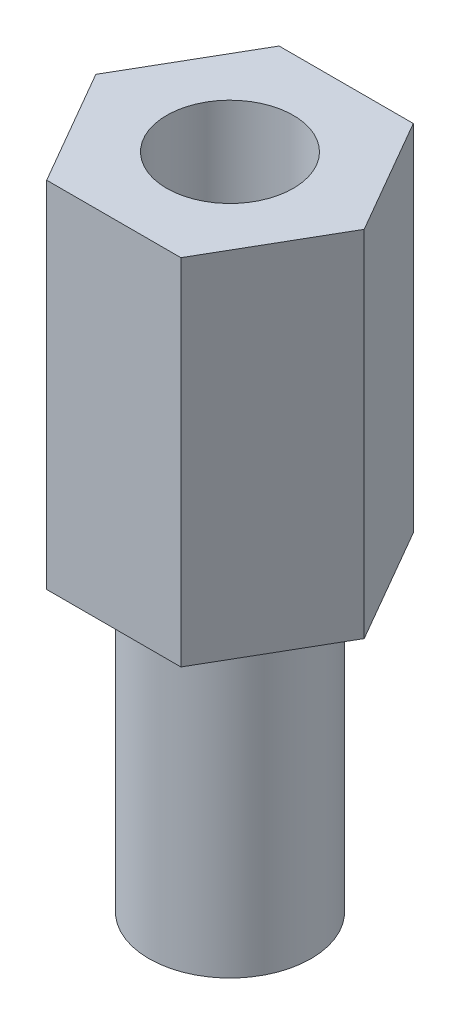
ISO-10303-21;
HEADER;
FILE_DESCRIPTION(('STEP AP214'),'2;1');
FILE_NAME('part.step','',(''),(''),'','','');
FILE_SCHEMA(('AUTOMOTIVE_DESIGN { 1 0 10303 214 1 1 1 1 }'));
ENDSEC;
DATA;
#1=APPLICATION_CONTEXT('core data for automotive mechanical design processes');
#2=APPLICATION_PROTOCOL_DEFINITION('international standard','automotive_design',2000,#1);
#3=PRODUCT_CONTEXT('',#1,'mechanical');
#4=PRODUCT('Part','Part','',(#3));
#5=PRODUCT_RELATED_PRODUCT_CATEGORY('part','',(#4));
#6=PRODUCT_DEFINITION_FORMATION('','',#4);
#7=PRODUCT_DEFINITION_CONTEXT('part definition',#1,'design');
#8=PRODUCT_DEFINITION('design','',#6,#7);
#9=PRODUCT_DEFINITION_SHAPE('','',#8);
#10=(LENGTH_UNIT() NAMED_UNIT(*) SI_UNIT(.MILLI.,.METRE.));
#11=(NAMED_UNIT(*) PLANE_ANGLE_UNIT() SI_UNIT($,.RADIAN.));
#12=(NAMED_UNIT(*) SI_UNIT($,.STERADIAN.) SOLID_ANGLE_UNIT());
#13=UNCERTAINTY_MEASURE_WITH_UNIT(LENGTH_MEASURE(1.E-05),#10,'distance_accuracy_value','');
#14=(GEOMETRIC_REPRESENTATION_CONTEXT(3) GLOBAL_UNCERTAINTY_ASSIGNED_CONTEXT((#13)) GLOBAL_UNIT_ASSIGNED_CONTEXT((#10,
#11,#12)) REPRESENTATION_CONTEXT('',''));
#15=CARTESIAN_POINT('',(0.,0.,0.));
#16=DIRECTION('',(0.,0.,1.));
#17=DIRECTION('',(1.,0.,0.));
#18=AXIS2_PLACEMENT_3D('',#15,#16,#17);
#19=CARTESIAN_POINT('',(-1.325,7.,2.29496732002876));
#20=DIRECTION('',(0.,0.,-1.));
#21=DIRECTION('',(-1.,0.,0.));
#22=AXIS2_PLACEMENT_3D('',#19,#20,#21);
#23=PLANE('',#22);
#24=DIRECTION('',(1.,0.,0.));
#25=VECTOR('',#24,1.);
#26=CARTESIAN_POINT('',(-1.325,0.,2.29496732002876));
#27=LINE('',#26,#25);
#28=CARTESIAN_POINT('',(-1.325,0.,2.29496732002876));
#29=VERTEX_POINT('',#28);
#30=CARTESIAN_POINT('',(1.325,0.,2.29496732002876));
#31=VERTEX_POINT('',#30);
#32=EDGE_CURVE('E122',#29,#31,#27,.T.);
#33=ORIENTED_EDGE('',*,*,#32,.T.);
#34=DIRECTION('',(0.,-1.,0.));
#35=VECTOR('',#34,1.);
#36=CARTESIAN_POINT('',(1.325,7.,2.29496732002876));
#37=LINE('',#36,#35);
#38=CARTESIAN_POINT('',(1.325,7.,2.29496732002876));
#39=VERTEX_POINT('',#38);
#40=EDGE_CURVE('E45',#39,#31,#37,.T.);
#41=ORIENTED_EDGE('',*,*,#40,.F.);
#42=DIRECTION('',(1.,0.,0.));
#43=VECTOR('',#42,1.);
#44=CARTESIAN_POINT('',(-1.325,7.,2.29496732002876));
#45=LINE('',#44,#43);
#46=CARTESIAN_POINT('',(-1.325,7.,2.29496732002876));
#47=VERTEX_POINT('',#46);
#48=EDGE_CURVE('E133',#47,#39,#45,.T.);
#49=ORIENTED_EDGE('',*,*,#48,.F.);
#50=DIRECTION('',(0.,-1.,0.));
#51=VECTOR('',#50,1.);
#52=CARTESIAN_POINT('',(-1.325,7.,2.29496732002876));
#53=LINE('',#52,#51);
#54=EDGE_CURVE('E118',#47,#29,#53,.T.);
#55=ORIENTED_EDGE('',*,*,#54,.T.);
#56=EDGE_LOOP('',(#33,#41,#49,#55));
#57=FACE_BOUND('',#56,.T.);
#58=ADVANCED_FACE('F37',(#57),#23,.F.);
#59=CARTESIAN_POINT('',(1.325,7.,2.29496732002876));
#60=DIRECTION('',(-0.866025403784439,0.,-0.5));
#61=DIRECTION('',(-0.5,0.,0.866025403784439));
#62=AXIS2_PLACEMENT_3D('',#59,#60,#61);
#63=PLANE('',#62);
#64=DIRECTION('',(0.5,0.,-0.866025403784439));
#65=VECTOR('',#64,1.);
#66=CARTESIAN_POINT('',(1.325,0.,2.29496732002876));
#67=LINE('',#66,#65);
#68=CARTESIAN_POINT('',(2.65,0.,0.));
#69=VERTEX_POINT('',#68);
#70=EDGE_CURVE('E125',#31,#69,#67,.T.);
#71=ORIENTED_EDGE('',*,*,#70,.T.);
#72=DIRECTION('',(0.,-1.,0.));
#73=VECTOR('',#72,1.);
#74=CARTESIAN_POINT('',(2.65,7.,0.));
#75=LINE('',#74,#73);
#76=CARTESIAN_POINT('',(2.65,7.,0.));
#77=VERTEX_POINT('',#76);
#78=EDGE_CURVE('E137',#77,#69,#75,.T.);
#79=ORIENTED_EDGE('',*,*,#78,.F.);
#80=DIRECTION('',(0.5,0.,-0.866025403784439));
#81=VECTOR('',#80,1.);
#82=CARTESIAN_POINT('',(1.325,7.,2.29496732002876));
#83=LINE('',#82,#81);
#84=EDGE_CURVE('E91',#39,#77,#83,.T.);
#85=ORIENTED_EDGE('',*,*,#84,.F.);
#86=ORIENTED_EDGE('',*,*,#40,.T.);
#87=EDGE_LOOP('',(#71,#79,#85,#86));
#88=FACE_BOUND('',#87,.T.);
#89=ADVANCED_FACE('F140',(#88),#63,.F.);
#90=CARTESIAN_POINT('',(2.65,7.,0.));
#91=DIRECTION('',(-0.866025403784438,0.,0.5));
#92=DIRECTION('',(0.5,0.,0.866025403784439));
#93=AXIS2_PLACEMENT_3D('',#90,#91,#92);
#94=PLANE('',#93);
#95=DIRECTION('',(-0.5,0.,-0.866025403784439));
#96=VECTOR('',#95,1.);
#97=CARTESIAN_POINT('',(2.65,0.,0.));
#98=LINE('',#97,#96);
#99=CARTESIAN_POINT('',(1.325,0.,-2.29496732002876));
#100=VERTEX_POINT('',#99);
#101=EDGE_CURVE('E128',#69,#100,#98,.T.);
#102=ORIENTED_EDGE('',*,*,#101,.T.);
#103=DIRECTION('',(0.,-1.,0.));
#104=VECTOR('',#103,1.);
#105=CARTESIAN_POINT('',(1.325,7.,-2.29496732002876));
#106=LINE('',#105,#104);
#107=CARTESIAN_POINT('',(1.325,7.,-2.29496732002876));
#108=VERTEX_POINT('',#107);
#109=EDGE_CURVE('E113',#108,#100,#106,.T.);
#110=ORIENTED_EDGE('',*,*,#109,.F.);
#111=DIRECTION('',(-0.5,0.,-0.866025403784439));
#112=VECTOR('',#111,1.);
#113=CARTESIAN_POINT('',(2.65,7.,0.));
#114=LINE('',#113,#112);
#115=EDGE_CURVE('E104',#77,#108,#114,.T.);
#116=ORIENTED_EDGE('',*,*,#115,.F.);
#117=ORIENTED_EDGE('',*,*,#78,.T.);
#118=EDGE_LOOP('',(#102,#110,#116,#117));
#119=FACE_BOUND('',#118,.T.);
#120=ADVANCED_FACE('F148',(#119),#94,.F.);
#121=CARTESIAN_POINT('',(1.325,7.,-2.29496732002876));
#122=DIRECTION('',(0.,0.,1.));
#123=DIRECTION('',(1.,0.,0.));
#124=AXIS2_PLACEMENT_3D('',#121,#122,#123);
#125=PLANE('',#124);
#126=DIRECTION('',(-1.,0.,0.));
#127=VECTOR('',#126,1.);
#128=CARTESIAN_POINT('',(1.325,0.,-2.29496732002876));
#129=LINE('',#128,#127);
#130=CARTESIAN_POINT('',(-1.325,0.,-2.29496732002876));
#131=VERTEX_POINT('',#130);
#132=EDGE_CURVE('E112',#100,#131,#129,.T.);
#133=ORIENTED_EDGE('',*,*,#132,.T.);
#134=DIRECTION('',(0.,-1.,0.));
#135=VECTOR('',#134,1.);
#136=CARTESIAN_POINT('',(-1.325,7.,-2.29496732002876));
#137=LINE('',#136,#135);
#138=CARTESIAN_POINT('',(-1.325,7.,-2.29496732002876));
#139=VERTEX_POINT('',#138);
#140=EDGE_CURVE('E109',#139,#131,#137,.T.);
#141=ORIENTED_EDGE('',*,*,#140,.F.);
#142=DIRECTION('',(-1.,0.,0.));
#143=VECTOR('',#142,1.);
#144=CARTESIAN_POINT('',(1.325,7.,-2.29496732002876));
#145=LINE('',#144,#143);
#146=EDGE_CURVE('E98',#108,#139,#145,.T.);
#147=ORIENTED_EDGE('',*,*,#146,.F.);
#148=ORIENTED_EDGE('',*,*,#109,.T.);
#149=EDGE_LOOP('',(#133,#141,#147,#148));
#150=FACE_BOUND('',#149,.T.);
#151=ADVANCED_FACE('F110',(#150),#125,.F.);
#152=CARTESIAN_POINT('',(-1.325,7.,-2.29496732002876));
#153=DIRECTION('',(0.866025403784439,0.,0.5));
#154=DIRECTION('',(0.5,0.,-0.866025403784439));
#155=AXIS2_PLACEMENT_3D('',#152,#153,#154);
#156=PLANE('',#155);
#157=DIRECTION('',(-0.5,0.,0.866025403784439));
#158=VECTOR('',#157,1.);
#159=CARTESIAN_POINT('',(-1.325,0.,-2.29496732002876));
#160=LINE('',#159,#158);
#161=CARTESIAN_POINT('',(-2.65,0.,0.));
#162=VERTEX_POINT('',#161);
#163=EDGE_CURVE('E76',#131,#162,#160,.T.);
#164=ORIENTED_EDGE('',*,*,#163,.T.);
#165=DIRECTION('',(0.,-1.,0.));
#166=VECTOR('',#165,1.);
#167=CARTESIAN_POINT('',(-2.65,7.,0.));
#168=LINE('',#167,#166);
#169=CARTESIAN_POINT('',(-2.65,7.,0.));
#170=VERTEX_POINT('',#169);
#171=EDGE_CURVE('E114',#170,#162,#168,.T.);
#172=ORIENTED_EDGE('',*,*,#171,.F.);
#173=DIRECTION('',(-0.5,0.,0.866025403784439));
#174=VECTOR('',#173,1.);
#175=CARTESIAN_POINT('',(-1.325,7.,-2.29496732002876));
#176=LINE('',#175,#174);
#177=EDGE_CURVE('E102',#139,#170,#176,.T.);
#178=ORIENTED_EDGE('',*,*,#177,.F.);
#179=ORIENTED_EDGE('',*,*,#140,.T.);
#180=EDGE_LOOP('',(#164,#172,#178,#179));
#181=FACE_BOUND('',#180,.T.);
#182=ADVANCED_FACE('F116',(#181),#156,.F.);
#183=CARTESIAN_POINT('',(-2.65,7.,0.));
#184=DIRECTION('',(0.866025403784438,0.,-0.5));
#185=DIRECTION('',(-0.5,0.,-0.866025403784439));
#186=AXIS2_PLACEMENT_3D('',#183,#184,#185);
#187=PLANE('',#186);
#188=DIRECTION('',(0.5,0.,0.866025403784439));
#189=VECTOR('',#188,1.);
#190=CARTESIAN_POINT('',(-2.65,0.,0.));
#191=LINE('',#190,#189);
#192=EDGE_CURVE('E82',#162,#29,#191,.T.);
#193=ORIENTED_EDGE('',*,*,#192,.T.);
#194=ORIENTED_EDGE('',*,*,#54,.F.);
#195=DIRECTION('',(0.5,0.,0.866025403784439));
#196=VECTOR('',#195,1.);
#197=CARTESIAN_POINT('',(-2.65,7.,0.));
#198=LINE('',#197,#196);
#199=EDGE_CURVE('E53',#170,#47,#198,.T.);
#200=ORIENTED_EDGE('',*,*,#199,.F.);
#201=ORIENTED_EDGE('',*,*,#171,.T.);
#202=EDGE_LOOP('',(#193,#194,#200,#201));
#203=FACE_BOUND('',#202,.T.);
#204=ADVANCED_FACE('F171',(#203),#187,.F.);
#205=CARTESIAN_POINT('',(0.,7.,0.));
#206=DIRECTION('',(0.,1.,0.));
#207=DIRECTION('',(0.,0.,1.));
#208=AXIS2_PLACEMENT_3D('',#205,#206,#207);
#209=PLANE('',#208);
#210=CARTESIAN_POINT('',(0.,7.,0.));
#211=DIRECTION('',(0.,1.,0.));
#212=DIRECTION('',(0.,0.,1.));
#213=AXIS2_PLACEMENT_3D('',#210,#211,#212);
#214=CIRCLE('',#213,1.25);
#215=CARTESIAN_POINT('',(0.,7.,1.25));
#216=VERTEX_POINT('',#215);
#217=EDGE_CURVE('E155',#216,#216,#214,.T.);
#218=ORIENTED_EDGE('',*,*,#217,.F.);
#219=EDGE_LOOP('',(#218));
#220=FACE_BOUND('',#219,.T.);
#221=ORIENTED_EDGE('',*,*,#48,.T.);
#222=ORIENTED_EDGE('',*,*,#84,.T.);
#223=ORIENTED_EDGE('',*,*,#115,.T.);
#224=ORIENTED_EDGE('',*,*,#146,.T.);
#225=ORIENTED_EDGE('',*,*,#177,.T.);
#226=ORIENTED_EDGE('',*,*,#199,.T.);
#227=EDGE_LOOP('',(#221,#222,#223,#224,#225,#226));
#228=FACE_BOUND('',#227,.T.);
#229=ADVANCED_FACE('F100',(#220,#228),#209,.T.);
#230=CARTESIAN_POINT('',(0.,0.,0.));
#231=DIRECTION('',(0.,1.,0.));
#232=DIRECTION('',(0.,0.,1.));
#233=AXIS2_PLACEMENT_3D('',#230,#231,#232);
#234=PLANE('',#233);
#235=CARTESIAN_POINT('',(0.,0.,0.));
#236=DIRECTION('',(0.,1.,0.));
#237=DIRECTION('',(0.,0.,1.));
#238=AXIS2_PLACEMENT_3D('',#235,#236,#237);
#239=CIRCLE('',#238,1.6);
#240=CARTESIAN_POINT('',(0.,0.,1.6));
#241=VERTEX_POINT('',#240);
#242=EDGE_CURVE('E11',#241,#241,#239,.F.);
#243=ORIENTED_EDGE('',*,*,#242,.F.);
#244=EDGE_LOOP('',(#243));
#245=FACE_BOUND('',#244,.T.);
#246=ORIENTED_EDGE('',*,*,#32,.F.);
#247=ORIENTED_EDGE('',*,*,#192,.F.);
#248=ORIENTED_EDGE('',*,*,#163,.F.);
#249=ORIENTED_EDGE('',*,*,#132,.F.);
#250=ORIENTED_EDGE('',*,*,#101,.F.);
#251=ORIENTED_EDGE('',*,*,#70,.F.);
#252=EDGE_LOOP('',(#246,#247,#248,#249,#250,#251));
#253=FACE_BOUND('',#252,.T.);
#254=ADVANCED_FACE('F145',(#245,#253),#234,.F.);
#255=CARTESIAN_POINT('',(0.,-6.,0.));
#256=DIRECTION('',(0.,1.,0.));
#257=DIRECTION('',(0.,0.,1.));
#258=AXIS2_PLACEMENT_3D('',#255,#256,#257);
#259=CYLINDRICAL_SURFACE('',#258,1.6);
#260=CARTESIAN_POINT('',(0.,-6.,0.));
#261=DIRECTION('',(0.,-1.,0.));
#262=DIRECTION('',(0.,0.,-1.));
#263=AXIS2_PLACEMENT_3D('',#260,#261,#262);
#264=CIRCLE('',#263,1.6);
#265=CARTESIAN_POINT('',(0.,-6.,-1.6));
#266=VERTEX_POINT('',#265);
#267=EDGE_CURVE('E126',#266,#266,#264,.T.);
#268=ORIENTED_EDGE('',*,*,#267,.F.);
#269=EDGE_LOOP('',(#268));
#270=FACE_BOUND('',#269,.T.);
#271=ORIENTED_EDGE('',*,*,#242,.T.);
#272=EDGE_LOOP('',(#271));
#273=FACE_BOUND('',#272,.T.);
#274=ADVANCED_FACE('F177',(#270,#273),#259,.T.);
#275=CARTESIAN_POINT('',(0.,-6.,0.));
#276=DIRECTION('',(0.,-1.,0.));
#277=DIRECTION('',(0.,0.,-1.));
#278=AXIS2_PLACEMENT_3D('',#275,#276,#277);
#279=PLANE('',#278);
#280=ORIENTED_EDGE('',*,*,#267,.T.);
#281=EDGE_LOOP('',(#280));
#282=FACE_BOUND('',#281,.T.);
#283=ADVANCED_FACE('F166',(#282),#279,.T.);
#284=CARTESIAN_POINT('',(0.,2.,0.));
#285=DIRECTION('',(0.,1.,0.));
#286=DIRECTION('',(0.,0.,1.));
#287=AXIS2_PLACEMENT_3D('',#284,#285,#286);
#288=CYLINDRICAL_SURFACE('',#287,1.25);
#289=CARTESIAN_POINT('',(0.,2.,0.));
#290=DIRECTION('',(0.,1.,0.));
#291=DIRECTION('',(0.,0.,1.));
#292=AXIS2_PLACEMENT_3D('',#289,#290,#291);
#293=CIRCLE('',#292,1.25);
#294=CARTESIAN_POINT('',(0.,2.,1.25));
#295=VERTEX_POINT('',#294);
#296=EDGE_CURVE('E154',#295,#295,#293,.T.);
#297=ORIENTED_EDGE('',*,*,#296,.F.);
#298=EDGE_LOOP('',(#297));
#299=FACE_BOUND('',#298,.T.);
#300=ORIENTED_EDGE('',*,*,#217,.T.);
#301=EDGE_LOOP('',(#300));
#302=FACE_BOUND('',#301,.T.);
#303=ADVANCED_FACE('F163',(#299,#302),#288,.F.);
#304=CARTESIAN_POINT('',(0.,2.,0.));
#305=DIRECTION('',(0.,1.,0.));
#306=DIRECTION('',(0.,0.,1.));
#307=AXIS2_PLACEMENT_3D('',#304,#305,#306);
#308=PLANE('',#307);
#309=ORIENTED_EDGE('',*,*,#296,.T.);
#310=EDGE_LOOP('',(#309));
#311=FACE_BOUND('',#310,.T.);
#312=ADVANCED_FACE('F161',(#311),#308,.T.);
#313=CLOSED_SHELL('',(#58,#89,#120,#151,#182,#204,#229,#254,#274,#283,#303,#312));
#314=MANIFOLD_SOLID_BREP('B2',#313);
#315=ADVANCED_BREP_SHAPE_REPRESENTATION('',(#18,#314),#14);
#316=SHAPE_DEFINITION_REPRESENTATION(#9,#315);
ENDSEC;
END-ISO-10303-21;
